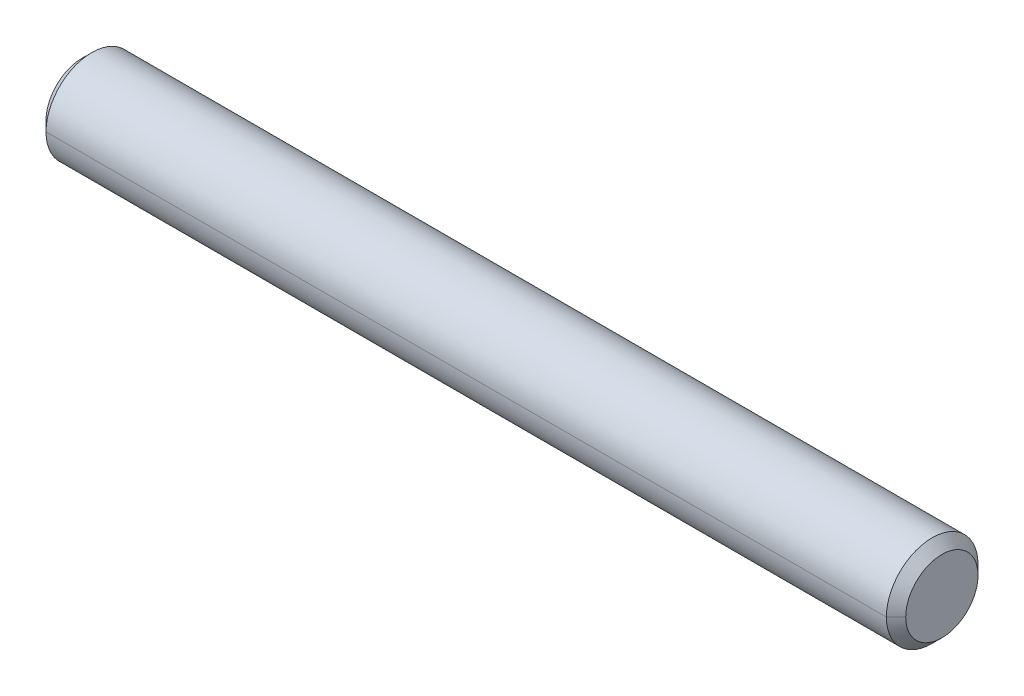
ISO-10303-21;
HEADER;
FILE_DESCRIPTION(('STEP AP214'),'2;1');
FILE_NAME('part.step','',(''),(''),'','','');
FILE_SCHEMA(('AUTOMOTIVE_DESIGN { 1 0 10303 214 1 1 1 1 }'));
ENDSEC;
DATA;
#1=APPLICATION_CONTEXT('core data for automotive mechanical design processes');
#2=APPLICATION_PROTOCOL_DEFINITION('international standard','automotive_design',2000,#1);
#3=PRODUCT_CONTEXT('',#1,'mechanical');
#4=PRODUCT('Part','Part','',(#3));
#5=PRODUCT_RELATED_PRODUCT_CATEGORY('part','',(#4));
#6=PRODUCT_DEFINITION_FORMATION('','',#4);
#7=PRODUCT_DEFINITION_CONTEXT('part definition',#1,'design');
#8=PRODUCT_DEFINITION('design','',#6,#7);
#9=PRODUCT_DEFINITION_SHAPE('','',#8);
#10=(LENGTH_UNIT() NAMED_UNIT(*) SI_UNIT(.MILLI.,.METRE.));
#11=(NAMED_UNIT(*) PLANE_ANGLE_UNIT() SI_UNIT($,.RADIAN.));
#12=(NAMED_UNIT(*) SI_UNIT($,.STERADIAN.) SOLID_ANGLE_UNIT());
#13=UNCERTAINTY_MEASURE_WITH_UNIT(LENGTH_MEASURE(1.E-05),#10,'distance_accuracy_value','');
#14=(GEOMETRIC_REPRESENTATION_CONTEXT(3) GLOBAL_UNCERTAINTY_ASSIGNED_CONTEXT((#13)) GLOBAL_UNIT_ASSIGNED_CONTEXT((#10,
#11,#12)) REPRESENTATION_CONTEXT('',''));
#15=CARTESIAN_POINT('',(0.,0.,0.));
#16=DIRECTION('',(0.,0.,1.));
#17=DIRECTION('',(1.,0.,0.));
#18=AXIS2_PLACEMENT_3D('',#15,#16,#17);
#19=CARTESIAN_POINT('',(22.225,0.,0.));
#20=DIRECTION('',(-1.,0.,0.));
#21=DIRECTION('',(0.,0.,1.));
#22=AXIS2_PLACEMENT_3D('',#19,#20,#21);
#23=CONICAL_SURFACE('',#22,1.86855,0.785398163397448);
#24=DIRECTION('',(-0.707106781186548,0.,-0.707106781186547));
#25=VECTOR('',#24,1.);
#26=CARTESIAN_POINT('',(22.225,0.,-1.86855));
#27=LINE('',#26,#25);
#28=CARTESIAN_POINT('',(22.225,0.,-1.86855));
#29=VERTEX_POINT('',#28);
#30=CARTESIAN_POINT('',(21.725,0.,-2.36855));
#31=VERTEX_POINT('',#30);
#32=EDGE_CURVE('E103',#29,#31,#27,.T.);
#33=ORIENTED_EDGE('',*,*,#32,.F.);
#34=CARTESIAN_POINT('',(22.225,0.,0.));
#35=DIRECTION('',(1.,0.,0.));
#36=DIRECTION('',(0.,0.,-1.));
#37=AXIS2_PLACEMENT_3D('',#34,#35,#36);
#38=CIRCLE('',#37,1.86855);
#39=CARTESIAN_POINT('',(22.225,0.,1.86855));
#40=VERTEX_POINT('',#39);
#41=EDGE_CURVE('E27',#40,#29,#38,.T.);
#42=ORIENTED_EDGE('',*,*,#41,.F.);
#43=DIRECTION('',(-0.707106781186548,0.,0.707106781186547));
#44=VECTOR('',#43,1.);
#45=CARTESIAN_POINT('',(22.225,0.,1.86855));
#46=LINE('',#45,#44);
#47=CARTESIAN_POINT('',(21.725,0.,2.36855));
#48=VERTEX_POINT('',#47);
#49=EDGE_CURVE('E20',#40,#48,#46,.T.);
#50=ORIENTED_EDGE('',*,*,#49,.T.);
#51=CARTESIAN_POINT('',(21.725,0.,0.));
#52=DIRECTION('',(-1.,0.,0.));
#53=DIRECTION('',(0.,0.,-1.));
#54=AXIS2_PLACEMENT_3D('',#51,#52,#53);
#55=CIRCLE('',#54,2.36855);
#56=EDGE_CURVE('E80',#31,#48,#55,.T.);
#57=ORIENTED_EDGE('',*,*,#56,.F.);
#58=EDGE_LOOP('',(#33,#42,#50,#57));
#59=FACE_BOUND('',#58,.T.);
#60=ADVANCED_FACE('F16',(#59),#23,.T.);
#61=CARTESIAN_POINT('',(-21.725,0.,0.));
#62=DIRECTION('',(1.,0.,0.));
#63=DIRECTION('',(0.,0.,-1.));
#64=AXIS2_PLACEMENT_3D('',#61,#62,#63);
#65=CONICAL_SURFACE('',#64,2.36855,0.785398163397445);
#66=DIRECTION('',(0.70710678118655,0.,0.707106781186545));
#67=VECTOR('',#66,1.);
#68=CARTESIAN_POINT('',(-21.725,0.,2.36855));
#69=LINE('',#68,#67);
#70=CARTESIAN_POINT('',(-22.225,0.,1.86855));
#71=VERTEX_POINT('',#70);
#72=CARTESIAN_POINT('',(-21.725,0.,2.36855));
#73=VERTEX_POINT('',#72);
#74=EDGE_CURVE('E118',#71,#73,#69,.T.);
#75=ORIENTED_EDGE('',*,*,#74,.F.);
#76=CARTESIAN_POINT('',(-22.225,0.,0.));
#77=DIRECTION('',(-1.,0.,0.));
#78=DIRECTION('',(0.,0.,-1.));
#79=AXIS2_PLACEMENT_3D('',#76,#77,#78);
#80=CIRCLE('',#79,1.86855);
#81=CARTESIAN_POINT('',(-22.225,0.,-1.86855));
#82=VERTEX_POINT('',#81);
#83=EDGE_CURVE('E11',#82,#71,#80,.T.);
#84=ORIENTED_EDGE('',*,*,#83,.F.);
#85=DIRECTION('',(0.70710678118655,0.,-0.707106781186545));
#86=VECTOR('',#85,1.);
#87=CARTESIAN_POINT('',(-21.725,0.,-2.36855));
#88=LINE('',#87,#86);
#89=CARTESIAN_POINT('',(-21.725,0.,-2.36855));
#90=VERTEX_POINT('',#89);
#91=EDGE_CURVE('E122',#82,#90,#88,.T.);
#92=ORIENTED_EDGE('',*,*,#91,.T.);
#93=CARTESIAN_POINT('',(-21.725,0.,0.));
#94=DIRECTION('',(1.,0.,0.));
#95=DIRECTION('',(0.,0.,-1.));
#96=AXIS2_PLACEMENT_3D('',#93,#94,#95);
#97=CIRCLE('',#96,2.36855);
#98=EDGE_CURVE('E41',#73,#90,#97,.T.);
#99=ORIENTED_EDGE('',*,*,#98,.F.);
#100=EDGE_LOOP('',(#75,#84,#92,#99));
#101=FACE_BOUND('',#100,.T.);
#102=ADVANCED_FACE('F134',(#101),#65,.T.);
#103=CARTESIAN_POINT('',(-22.225,0.,0.));
#104=DIRECTION('',(1.,0.,0.));
#105=DIRECTION('',(0.,1.,0.));
#106=AXIS2_PLACEMENT_3D('',#103,#104,#105);
#107=PLANE('',#106);
#108=ORIENTED_EDGE('',*,*,#83,.T.);
#109=CARTESIAN_POINT('',(-22.225,0.,0.));
#110=DIRECTION('',(-1.,0.,0.));
#111=DIRECTION('',(0.,0.,-1.));
#112=AXIS2_PLACEMENT_3D('',#109,#110,#111);
#113=CIRCLE('',#112,1.86855);
#114=EDGE_CURVE('E101',#71,#82,#113,.T.);
#115=ORIENTED_EDGE('',*,*,#114,.T.);
#116=EDGE_LOOP('',(#108,#115));
#117=FACE_BOUND('',#116,.T.);
#118=ADVANCED_FACE('F138',(#117),#107,.F.);
#119=CARTESIAN_POINT('',(22.225,0.,0.));
#120=DIRECTION('',(1.,0.,0.));
#121=DIRECTION('',(0.,1.,0.));
#122=AXIS2_PLACEMENT_3D('',#119,#120,#121);
#123=PLANE('',#122);
#124=ORIENTED_EDGE('',*,*,#41,.T.);
#125=CARTESIAN_POINT('',(22.225,0.,0.));
#126=DIRECTION('',(1.,0.,0.));
#127=DIRECTION('',(0.,0.,-1.));
#128=AXIS2_PLACEMENT_3D('',#125,#126,#127);
#129=CIRCLE('',#128,1.86855);
#130=EDGE_CURVE('E111',#29,#40,#129,.T.);
#131=ORIENTED_EDGE('',*,*,#130,.T.);
#132=EDGE_LOOP('',(#124,#131));
#133=FACE_BOUND('',#132,.T.);
#134=ADVANCED_FACE('F140',(#133),#123,.T.);
#135=CARTESIAN_POINT('',(22.225,0.,0.));
#136=DIRECTION('',(-1.,0.,0.));
#137=DIRECTION('',(0.,0.,1.));
#138=AXIS2_PLACEMENT_3D('',#135,#136,#137);
#139=CYLINDRICAL_SURFACE('',#138,2.36855);
#140=DIRECTION('',(-1.,0.,0.));
#141=VECTOR('',#140,1.);
#142=CARTESIAN_POINT('',(22.225,0.,-2.36855));
#143=LINE('',#142,#141);
#144=EDGE_CURVE('E84',#31,#90,#143,.T.);
#145=ORIENTED_EDGE('',*,*,#144,.F.);
#146=ORIENTED_EDGE('',*,*,#56,.T.);
#147=DIRECTION('',(-1.,0.,0.));
#148=VECTOR('',#147,1.);
#149=CARTESIAN_POINT('',(22.225,0.,2.36855));
#150=LINE('',#149,#148);
#151=EDGE_CURVE('E82',#48,#73,#150,.T.);
#152=ORIENTED_EDGE('',*,*,#151,.T.);
#153=ORIENTED_EDGE('',*,*,#98,.T.);
#154=EDGE_LOOP('',(#145,#146,#152,#153));
#155=FACE_BOUND('',#154,.T.);
#156=ADVANCED_FACE('F18',(#155),#139,.T.);
#157=CARTESIAN_POINT('',(22.225,0.,0.));
#158=DIRECTION('',(-1.,0.,0.));
#159=DIRECTION('',(0.,0.,1.));
#160=AXIS2_PLACEMENT_3D('',#157,#158,#159);
#161=CYLINDRICAL_SURFACE('',#160,2.36855);
#162=CARTESIAN_POINT('',(21.725,0.,0.));
#163=DIRECTION('',(-1.,0.,0.));
#164=DIRECTION('',(0.,0.,-1.));
#165=AXIS2_PLACEMENT_3D('',#162,#163,#164);
#166=CIRCLE('',#165,2.36855);
#167=EDGE_CURVE('E91',#48,#31,#166,.T.);
#168=ORIENTED_EDGE('',*,*,#167,.T.);
#169=ORIENTED_EDGE('',*,*,#144,.T.);
#170=CARTESIAN_POINT('',(-21.725,0.,0.));
#171=DIRECTION('',(1.,0.,0.));
#172=DIRECTION('',(0.,0.,-1.));
#173=AXIS2_PLACEMENT_3D('',#170,#171,#172);
#174=CIRCLE('',#173,2.36855);
#175=EDGE_CURVE('E94',#90,#73,#174,.T.);
#176=ORIENTED_EDGE('',*,*,#175,.T.);
#177=ORIENTED_EDGE('',*,*,#151,.F.);
#178=EDGE_LOOP('',(#168,#169,#176,#177));
#179=FACE_BOUND('',#178,.T.);
#180=ADVANCED_FACE('F89',(#179),#161,.T.);
#181=CARTESIAN_POINT('',(-21.725,0.,0.));
#182=DIRECTION('',(1.,0.,0.));
#183=DIRECTION('',(0.,0.,-1.));
#184=AXIS2_PLACEMENT_3D('',#181,#182,#183);
#185=CONICAL_SURFACE('',#184,2.36855,0.785398163397445);
#186=ORIENTED_EDGE('',*,*,#114,.F.);
#187=ORIENTED_EDGE('',*,*,#74,.T.);
#188=ORIENTED_EDGE('',*,*,#175,.F.);
#189=ORIENTED_EDGE('',*,*,#91,.F.);
#190=EDGE_LOOP('',(#186,#187,#188,#189));
#191=FACE_BOUND('',#190,.T.);
#192=ADVANCED_FACE('F137',(#191),#185,.T.);
#193=CARTESIAN_POINT('',(22.225,0.,0.));
#194=DIRECTION('',(-1.,0.,0.));
#195=DIRECTION('',(0.,0.,1.));
#196=AXIS2_PLACEMENT_3D('',#193,#194,#195);
#197=CONICAL_SURFACE('',#196,1.86855,0.785398163397448);
#198=ORIENTED_EDGE('',*,*,#130,.F.);
#199=ORIENTED_EDGE('',*,*,#32,.T.);
#200=ORIENTED_EDGE('',*,*,#167,.F.);
#201=ORIENTED_EDGE('',*,*,#49,.F.);
#202=EDGE_LOOP('',(#198,#199,#200,#201));
#203=FACE_BOUND('',#202,.T.);
#204=ADVANCED_FACE('F102',(#203),#197,.T.);
#205=CLOSED_SHELL('',(#60,#102,#118,#134,#156,#180,#192,#204));
#206=MANIFOLD_SOLID_BREP('B1',#205);
#207=ADVANCED_BREP_SHAPE_REPRESENTATION('',(#18,#206),#14);
#208=SHAPE_DEFINITION_REPRESENTATION(#9,#207);
ENDSEC;
END-ISO-10303-21;
